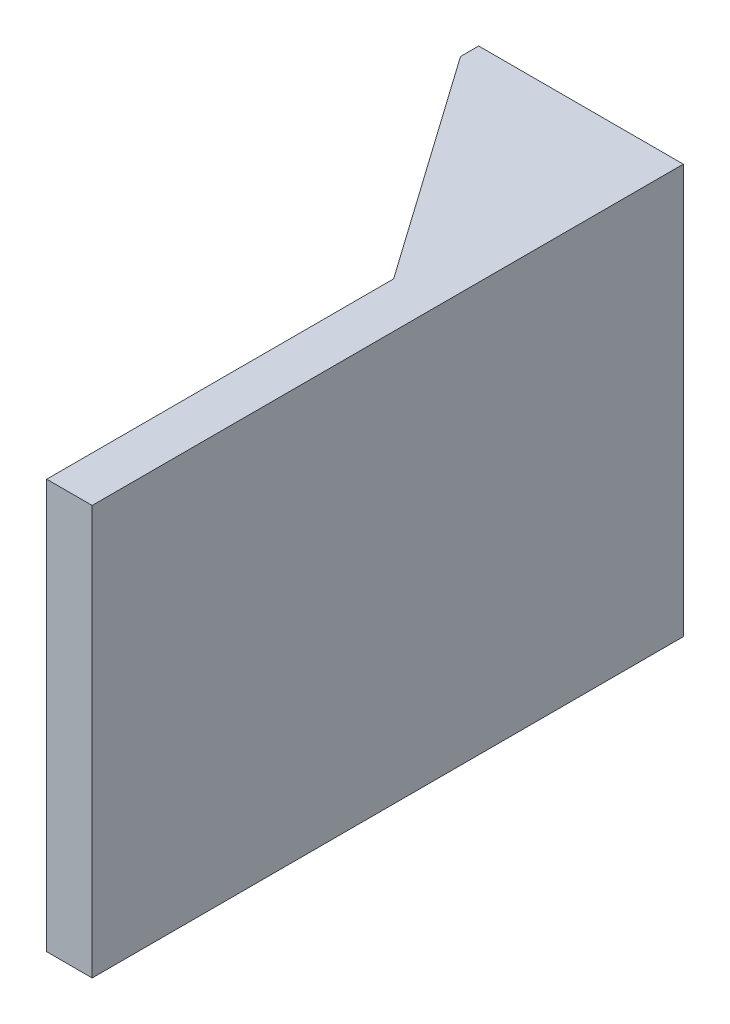
ISO-10303-21;
HEADER;
FILE_DESCRIPTION(('STEP AP214'),'2;1');
FILE_NAME('part.step','',(''),(''),'','','');
FILE_SCHEMA(('AUTOMOTIVE_DESIGN { 1 0 10303 214 1 1 1 1 }'));
ENDSEC;
DATA;
#1=APPLICATION_CONTEXT('core data for automotive mechanical design processes');
#2=APPLICATION_PROTOCOL_DEFINITION('international standard','automotive_design',2000,#1);
#3=PRODUCT_CONTEXT('',#1,'mechanical');
#4=PRODUCT('Part','Part','',(#3));
#5=PRODUCT_RELATED_PRODUCT_CATEGORY('part','',(#4));
#6=PRODUCT_DEFINITION_FORMATION('','',#4);
#7=PRODUCT_DEFINITION_CONTEXT('part definition',#1,'design');
#8=PRODUCT_DEFINITION('design','',#6,#7);
#9=PRODUCT_DEFINITION_SHAPE('','',#8);
#10=(LENGTH_UNIT() NAMED_UNIT(*) SI_UNIT(.MILLI.,.METRE.));
#11=(NAMED_UNIT(*) PLANE_ANGLE_UNIT() SI_UNIT($,.RADIAN.));
#12=(NAMED_UNIT(*) SI_UNIT($,.STERADIAN.) SOLID_ANGLE_UNIT());
#13=UNCERTAINTY_MEASURE_WITH_UNIT(LENGTH_MEASURE(1.E-05),#10,'distance_accuracy_value','');
#14=(GEOMETRIC_REPRESENTATION_CONTEXT(3) GLOBAL_UNCERTAINTY_ASSIGNED_CONTEXT((#13)) GLOBAL_UNIT_ASSIGNED_CONTEXT((#10,
#11,#12)) REPRESENTATION_CONTEXT('',''));
#15=CARTESIAN_POINT('',(0.,0.,0.));
#16=DIRECTION('',(0.,0.,1.));
#17=DIRECTION('',(1.,0.,0.));
#18=AXIS2_PLACEMENT_3D('',#15,#16,#17);
#19=CARTESIAN_POINT('',(-6.94328423022527,5.,0.));
#20=DIRECTION('',(1.,0.,0.));
#21=DIRECTION('',(0.,0.,-1.));
#22=AXIS2_PLACEMENT_3D('',#19,#20,#21);
#23=PLANE('',#22);
#24=DIRECTION('',(0.,-1.,0.));
#25=VECTOR('',#24,1.);
#26=CARTESIAN_POINT('',(-6.94328423022529,5.,-33.0643830535921));
#27=LINE('',#26,#25);
#28=CARTESIAN_POINT('',(-6.94328423022529,5.,-33.0643830535921));
#29=VERTEX_POINT('',#28);
#30=CARTESIAN_POINT('',(-6.94328423022529,-40.,-33.0643830535921));
#31=VERTEX_POINT('',#30);
#32=EDGE_CURVE('E59',#29,#31,#27,.T.);
#33=ORIENTED_EDGE('',*,*,#32,.T.);
#34=DIRECTION('',(0.,0.,1.));
#35=VECTOR('',#34,1.);
#36=CARTESIAN_POINT('',(-6.94328423022527,-40.,0.));
#37=LINE('',#36,#35);
#38=CARTESIAN_POINT('',(-6.94328423022529,-40.,-31.064383053592));
#39=VERTEX_POINT('',#38);
#40=EDGE_CURVE('E157',#31,#39,#37,.T.);
#41=ORIENTED_EDGE('',*,*,#40,.T.);
#42=DIRECTION('',(0.,1.,0.));
#43=VECTOR('',#42,1.);
#44=CARTESIAN_POINT('',(-6.94328423022529,-40.,-31.064383053592));
#45=LINE('',#44,#43);
#46=CARTESIAN_POINT('',(-6.94328423022529,0.,-31.064383053592));
#47=VERTEX_POINT('',#46);
#48=EDGE_CURVE('E154',#39,#47,#45,.T.);
#49=ORIENTED_EDGE('',*,*,#48,.T.);
#50=DIRECTION('',(0.,-1.,0.));
#51=VECTOR('',#50,1.);
#52=CARTESIAN_POINT('',(-6.94328423022529,5.,-31.064383053592));
#53=LINE('',#52,#51);
#54=CARTESIAN_POINT('',(-6.94328423022529,5.,-31.064383053592));
#55=VERTEX_POINT('',#54);
#56=EDGE_CURVE('E44',#55,#47,#53,.T.);
#57=ORIENTED_EDGE('',*,*,#56,.F.);
#58=DIRECTION('',(0.,0.,1.));
#59=VECTOR('',#58,1.);
#60=CARTESIAN_POINT('',(-6.94328423022527,5.,0.));
#61=LINE('',#60,#59);
#62=EDGE_CURVE('E135',#29,#55,#61,.T.);
#63=ORIENTED_EDGE('',*,*,#62,.F.);
#64=EDGE_LOOP('',(#33,#41,#49,#57,#63));
#65=FACE_BOUND('',#64,.T.);
#66=ADVANCED_FACE('F41',(#65),#23,.F.);
#67=CARTESIAN_POINT('',(9.98109312021038,5.,-7.02776989515074));
#68=DIRECTION('',(0.817650715923373,0.,-0.575714605295017));
#69=DIRECTION('',(-0.575714605295017,0.,-0.817650715923373));
#70=AXIS2_PLACEMENT_3D('',#67,#68,#69);
#71=PLANE('',#70);
#72=DIRECTION('',(0.575714605295017,0.,0.817650715923373));
#73=VECTOR('',#72,1.);
#74=CARTESIAN_POINT('',(9.98109312021038,0.,-7.02776989515074));
#75=LINE('',#74,#73);
#76=CARTESIAN_POINT('',(10.5567157697747,0.,-6.21024977808369));
#77=VERTEX_POINT('',#76);
#78=EDGE_CURVE('E72',#47,#77,#75,.T.);
#79=ORIENTED_EDGE('',*,*,#78,.T.);
#80=DIRECTION('',(0.,-1.,0.));
#81=VECTOR('',#80,1.);
#82=CARTESIAN_POINT('',(10.5567157697747,5.,-6.21024977808369));
#83=LINE('',#82,#81);
#84=CARTESIAN_POINT('',(10.5567157697747,5.,-6.21024977808369));
#85=VERTEX_POINT('',#84);
#86=EDGE_CURVE('E142',#85,#77,#83,.T.);
#87=ORIENTED_EDGE('',*,*,#86,.F.);
#88=DIRECTION('',(0.575714605295017,0.,0.817650715923373));
#89=VECTOR('',#88,1.);
#90=CARTESIAN_POINT('',(9.98109312021038,5.,-7.02776989515074));
#91=LINE('',#90,#89);
#92=EDGE_CURVE('E152',#55,#85,#91,.T.);
#93=ORIENTED_EDGE('',*,*,#92,.F.);
#94=ORIENTED_EDGE('',*,*,#56,.T.);
#95=EDGE_LOOP('',(#79,#87,#93,#94));
#96=FACE_BOUND('',#95,.T.);
#97=ADVANCED_FACE('F151',(#96),#71,.F.);
#98=CARTESIAN_POINT('',(10.5567157697747,5.,0.));
#99=DIRECTION('',(-1.,0.,0.));
#100=DIRECTION('',(0.,0.,1.));
#101=AXIS2_PLACEMENT_3D('',#98,#99,#100);
#102=PLANE('',#101);
#103=ORIENTED_EDGE('',*,*,#86,.T.);
#104=DIRECTION('',(0.,0.,-1.));
#105=VECTOR('',#104,1.);
#106=CARTESIAN_POINT('',(10.5567157697747,0.,0.));
#107=LINE('',#106,#105);
#108=CARTESIAN_POINT('',(10.5567157697747,0.,-31.0643830535921));
#109=VERTEX_POINT('',#108);
#110=EDGE_CURVE('E11',#77,#109,#107,.T.);
#111=ORIENTED_EDGE('',*,*,#110,.T.);
#112=DIRECTION('',(0.,1.,0.));
#113=VECTOR('',#112,1.);
#114=CARTESIAN_POINT('',(10.5567157697747,-40.,-31.0643830535921));
#115=LINE('',#114,#113);
#116=CARTESIAN_POINT('',(10.5567157697747,-40.,-31.0643830535921));
#117=VERTEX_POINT('',#116);
#118=EDGE_CURVE('E136',#117,#109,#115,.T.);
#119=ORIENTED_EDGE('',*,*,#118,.F.);
#120=DIRECTION('',(0.,0.,-1.));
#121=VECTOR('',#120,1.);
#122=CARTESIAN_POINT('',(10.5567157697747,-40.,0.));
#123=LINE('',#122,#121);
#124=CARTESIAN_POINT('',(10.5567157697747,-40.,31.9356169464079));
#125=VERTEX_POINT('',#124);
#126=EDGE_CURVE('E186',#125,#117,#123,.T.);
#127=ORIENTED_EDGE('',*,*,#126,.F.);
#128=DIRECTION('',(0.,-1.,0.));
#129=VECTOR('',#128,1.);
#130=CARTESIAN_POINT('',(10.5567157697747,5.,31.9356169464079));
#131=LINE('',#130,#129);
#132=CARTESIAN_POINT('',(10.5567157697747,5.,31.9356169464079));
#133=VERTEX_POINT('',#132);
#134=EDGE_CURVE('E111',#133,#125,#131,.T.);
#135=ORIENTED_EDGE('',*,*,#134,.F.);
#136=DIRECTION('',(0.,0.,-1.));
#137=VECTOR('',#136,1.);
#138=CARTESIAN_POINT('',(10.5567157697747,5.,0.));
#139=LINE('',#138,#137);
#140=EDGE_CURVE('E122',#133,#85,#139,.T.);
#141=ORIENTED_EDGE('',*,*,#140,.T.);
#142=EDGE_LOOP('',(#103,#111,#119,#127,#135,#141));
#143=FACE_BOUND('',#142,.T.);
#144=ADVANCED_FACE('F182',(#143),#102,.T.);
#145=CARTESIAN_POINT('',(0.,5.,31.9356169464079));
#146=DIRECTION('',(0.,0.,1.));
#147=DIRECTION('',(1.,0.,0.));
#148=AXIS2_PLACEMENT_3D('',#145,#146,#147);
#149=PLANE('',#148);
#150=ORIENTED_EDGE('',*,*,#134,.T.);
#151=DIRECTION('',(-1.,0.,0.));
#152=VECTOR('',#151,1.);
#153=CARTESIAN_POINT('',(0.,-40.,31.9356169464079));
#154=LINE('',#153,#152);
#155=CARTESIAN_POINT('',(15.5567157697747,-40.,31.935616946408));
#156=VERTEX_POINT('',#155);
#157=EDGE_CURVE('E105',#156,#125,#154,.T.);
#158=ORIENTED_EDGE('',*,*,#157,.F.);
#159=DIRECTION('',(0.,-1.,0.));
#160=VECTOR('',#159,1.);
#161=CARTESIAN_POINT('',(15.5567157697747,5.,31.935616946408));
#162=LINE('',#161,#160);
#163=CARTESIAN_POINT('',(15.5567157697747,5.,31.935616946408));
#164=VERTEX_POINT('',#163);
#165=EDGE_CURVE('E99',#164,#156,#162,.T.);
#166=ORIENTED_EDGE('',*,*,#165,.F.);
#167=DIRECTION('',(-1.,0.,0.));
#168=VECTOR('',#167,1.);
#169=CARTESIAN_POINT('',(0.,5.,31.9356169464079));
#170=LINE('',#169,#168);
#171=EDGE_CURVE('E103',#164,#133,#170,.T.);
#172=ORIENTED_EDGE('',*,*,#171,.T.);
#173=EDGE_LOOP('',(#150,#158,#166,#172));
#174=FACE_BOUND('',#173,.T.);
#175=ADVANCED_FACE('F102',(#174),#149,.T.);
#176=CARTESIAN_POINT('',(15.5567157697747,5.,0.));
#177=DIRECTION('',(1.,0.,0.));
#178=DIRECTION('',(0.,0.,-1.));
#179=AXIS2_PLACEMENT_3D('',#176,#177,#178);
#180=PLANE('',#179);
#181=ORIENTED_EDGE('',*,*,#165,.T.);
#182=DIRECTION('',(0.,0.,1.));
#183=VECTOR('',#182,1.);
#184=CARTESIAN_POINT('',(15.5567157697747,-40.,0.));
#185=LINE('',#184,#183);
#186=CARTESIAN_POINT('',(15.5567157697747,-40.,-33.0643830535921));
#187=VERTEX_POINT('',#186);
#188=EDGE_CURVE('E192',#187,#156,#185,.T.);
#189=ORIENTED_EDGE('',*,*,#188,.F.);
#190=DIRECTION('',(0.,-1.,0.));
#191=VECTOR('',#190,1.);
#192=CARTESIAN_POINT('',(15.5567157697747,5.,-33.0643830535921));
#193=LINE('',#192,#191);
#194=CARTESIAN_POINT('',(15.5567157697747,5.,-33.0643830535921));
#195=VERTEX_POINT('',#194);
#196=EDGE_CURVE('E112',#195,#187,#193,.T.);
#197=ORIENTED_EDGE('',*,*,#196,.F.);
#198=DIRECTION('',(0.,0.,1.));
#199=VECTOR('',#198,1.);
#200=CARTESIAN_POINT('',(15.5567157697747,5.,0.));
#201=LINE('',#200,#199);
#202=EDGE_CURVE('E120',#195,#164,#201,.T.);
#203=ORIENTED_EDGE('',*,*,#202,.T.);
#204=EDGE_LOOP('',(#181,#189,#197,#203));
#205=FACE_BOUND('',#204,.T.);
#206=ADVANCED_FACE('F125',(#205),#180,.T.);
#207=CARTESIAN_POINT('',(0.,5.,-33.0643830535921));
#208=DIRECTION('',(0.,0.,-1.));
#209=DIRECTION('',(-1.,0.,0.));
#210=AXIS2_PLACEMENT_3D('',#207,#208,#209);
#211=PLANE('',#210);
#212=ORIENTED_EDGE('',*,*,#196,.T.);
#213=DIRECTION('',(1.,0.,0.));
#214=VECTOR('',#213,1.);
#215=CARTESIAN_POINT('',(0.,-40.,-33.0643830535921));
#216=LINE('',#215,#214);
#217=EDGE_CURVE('E162',#31,#187,#216,.T.);
#218=ORIENTED_EDGE('',*,*,#217,.F.);
#219=ORIENTED_EDGE('',*,*,#32,.F.);
#220=DIRECTION('',(1.,0.,0.));
#221=VECTOR('',#220,1.);
#222=CARTESIAN_POINT('',(0.,5.,-33.0643830535921));
#223=LINE('',#222,#221);
#224=EDGE_CURVE('E127',#29,#195,#223,.T.);
#225=ORIENTED_EDGE('',*,*,#224,.T.);
#226=EDGE_LOOP('',(#212,#218,#219,#225));
#227=FACE_BOUND('',#226,.T.);
#228=ADVANCED_FACE('F203',(#227),#211,.T.);
#229=CARTESIAN_POINT('',(0.,5.,0.));
#230=DIRECTION('',(0.,1.,0.));
#231=DIRECTION('',(0.,0.,1.));
#232=AXIS2_PLACEMENT_3D('',#229,#230,#231);
#233=PLANE('',#232);
#234=ORIENTED_EDGE('',*,*,#62,.T.);
#235=ORIENTED_EDGE('',*,*,#92,.T.);
#236=ORIENTED_EDGE('',*,*,#140,.F.);
#237=ORIENTED_EDGE('',*,*,#171,.F.);
#238=ORIENTED_EDGE('',*,*,#202,.F.);
#239=ORIENTED_EDGE('',*,*,#224,.F.);
#240=EDGE_LOOP('',(#234,#235,#236,#237,#238,#239));
#241=FACE_BOUND('',#240,.T.);
#242=ADVANCED_FACE('F118',(#241),#233,.T.);
#243=CARTESIAN_POINT('',(0.,0.,0.));
#244=DIRECTION('',(0.,1.,0.));
#245=DIRECTION('',(0.,0.,1.));
#246=AXIS2_PLACEMENT_3D('',#243,#244,#245);
#247=PLANE('',#246);
#248=ORIENTED_EDGE('',*,*,#78,.F.);
#249=DIRECTION('',(1.,0.,0.));
#250=VECTOR('',#249,1.);
#251=CARTESIAN_POINT('',(0.,0.,-31.064383053592));
#252=LINE('',#251,#250);
#253=EDGE_CURVE('E165',#47,#109,#252,.T.);
#254=ORIENTED_EDGE('',*,*,#253,.T.);
#255=ORIENTED_EDGE('',*,*,#110,.F.);
#256=EDGE_LOOP('',(#248,#254,#255));
#257=FACE_BOUND('',#256,.T.);
#258=ADVANCED_FACE('F210',(#257),#247,.F.);
#259=CARTESIAN_POINT('',(0.,-40.,-31.064383053592));
#260=DIRECTION('',(0.,0.,1.));
#261=DIRECTION('',(1.,0.,0.));
#262=AXIS2_PLACEMENT_3D('',#259,#260,#261);
#263=PLANE('',#262);
#264=ORIENTED_EDGE('',*,*,#253,.F.);
#265=ORIENTED_EDGE('',*,*,#48,.F.);
#266=DIRECTION('',(1.,0.,0.));
#267=VECTOR('',#266,1.);
#268=CARTESIAN_POINT('',(0.,-40.,-31.064383053592));
#269=LINE('',#268,#267);
#270=EDGE_CURVE('E171',#39,#117,#269,.T.);
#271=ORIENTED_EDGE('',*,*,#270,.T.);
#272=ORIENTED_EDGE('',*,*,#118,.T.);
#273=EDGE_LOOP('',(#264,#265,#271,#272));
#274=FACE_BOUND('',#273,.T.);
#275=ADVANCED_FACE('F166',(#274),#263,.T.);
#276=CARTESIAN_POINT('',(0.,-40.,0.));
#277=DIRECTION('',(0.,1.,0.));
#278=DIRECTION('',(0.,0.,1.));
#279=AXIS2_PLACEMENT_3D('',#276,#277,#278);
#280=PLANE('',#279);
#281=ORIENTED_EDGE('',*,*,#40,.F.);
#282=ORIENTED_EDGE('',*,*,#217,.T.);
#283=ORIENTED_EDGE('',*,*,#188,.T.);
#284=ORIENTED_EDGE('',*,*,#157,.T.);
#285=ORIENTED_EDGE('',*,*,#126,.T.);
#286=ORIENTED_EDGE('',*,*,#270,.F.);
#287=EDGE_LOOP('',(#281,#282,#283,#284,#285,#286));
#288=FACE_BOUND('',#287,.T.);
#289=ADVANCED_FACE('F190',(#288),#280,.F.);
#290=CLOSED_SHELL('',(#66,#97,#144,#175,#206,#228,#242,#258,#275,#289));
#291=MANIFOLD_SOLID_BREP('B2',#290);
#292=ADVANCED_BREP_SHAPE_REPRESENTATION('',(#18,#291),#14);
#293=SHAPE_DEFINITION_REPRESENTATION(#9,#292);
ENDSEC;
END-ISO-10303-21;
